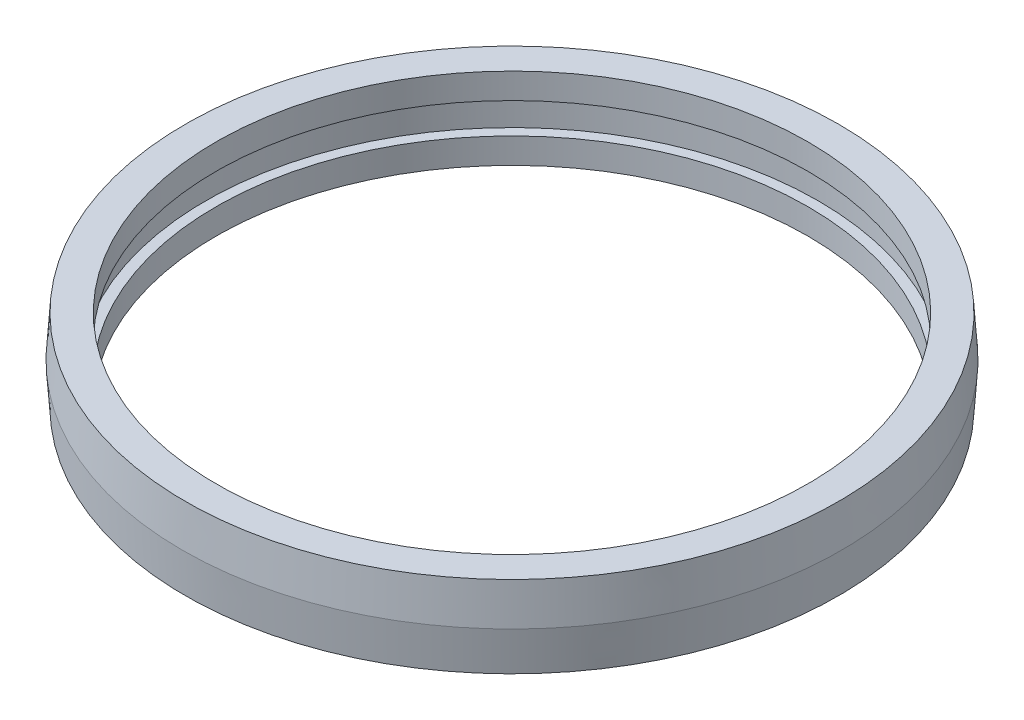
ISO-10303-21;
HEADER;
FILE_DESCRIPTION(('STEP AP214'),'2;1');
FILE_NAME('part.step','',(''),(''),'','','');
FILE_SCHEMA(('AUTOMOTIVE_DESIGN { 1 0 10303 214 1 1 1 1 }'));
ENDSEC;
DATA;
#1=APPLICATION_CONTEXT('core data for automotive mechanical design processes');
#2=APPLICATION_PROTOCOL_DEFINITION('international standard','automotive_design',2000,#1);
#3=PRODUCT_CONTEXT('',#1,'mechanical');
#4=PRODUCT('Part','Part','',(#3));
#5=PRODUCT_RELATED_PRODUCT_CATEGORY('part','',(#4));
#6=PRODUCT_DEFINITION_FORMATION('','',#4);
#7=PRODUCT_DEFINITION_CONTEXT('part definition',#1,'design');
#8=PRODUCT_DEFINITION('design','',#6,#7);
#9=PRODUCT_DEFINITION_SHAPE('','',#8);
#10=(LENGTH_UNIT() NAMED_UNIT(*) SI_UNIT(.MILLI.,.METRE.));
#11=(NAMED_UNIT(*) PLANE_ANGLE_UNIT() SI_UNIT($,.RADIAN.));
#12=(NAMED_UNIT(*) SI_UNIT($,.STERADIAN.) SOLID_ANGLE_UNIT());
#13=UNCERTAINTY_MEASURE_WITH_UNIT(LENGTH_MEASURE(1.E-05),#10,'distance_accuracy_value','');
#14=(GEOMETRIC_REPRESENTATION_CONTEXT(3) GLOBAL_UNCERTAINTY_ASSIGNED_CONTEXT((#13)) GLOBAL_UNIT_ASSIGNED_CONTEXT((#10,
#11,#12)) REPRESENTATION_CONTEXT('',''));
#15=CARTESIAN_POINT('',(0.,0.,0.));
#16=DIRECTION('',(0.,0.,1.));
#17=DIRECTION('',(1.,0.,0.));
#18=AXIS2_PLACEMENT_3D('',#15,#16,#17);
#19=CARTESIAN_POINT('',(0.,0.,0.));
#20=DIRECTION('',(0.,-1.,0.));
#21=DIRECTION('',(0.,0.,-1.));
#22=AXIS2_PLACEMENT_3D('',#19,#20,#21);
#23=CYLINDRICAL_SURFACE('',#22,92.075);
#24=CARTESIAN_POINT('',(0.,-4.76249999996453,0.));
#25=DIRECTION('',(0.,-1.,0.));
#26=DIRECTION('',(0.,0.,-1.));
#27=AXIS2_PLACEMENT_3D('',#24,#25,#26);
#28=CIRCLE('',#27,92.075);
#29=CARTESIAN_POINT('',(0.,-4.76249999996453,-92.075));
#30=VERTEX_POINT('',#29);
#31=EDGE_CURVE('E10',#30,#30,#28,.T.);
#32=ORIENTED_EDGE('',*,*,#31,.F.);
#33=EDGE_LOOP('',(#32));
#34=FACE_BOUND('',#33,.T.);
#35=CARTESIAN_POINT('',(0.,-12.6999999999596,0.));
#36=DIRECTION('',(0.,-1.,0.));
#37=DIRECTION('',(0.,0.,-1.));
#38=AXIS2_PLACEMENT_3D('',#35,#36,#37);
#39=CIRCLE('',#38,92.075);
#40=CARTESIAN_POINT('',(0.,-12.6999999999596,-92.075));
#41=VERTEX_POINT('',#40);
#42=EDGE_CURVE('E67',#41,#41,#39,.T.);
#43=ORIENTED_EDGE('',*,*,#42,.T.);
#44=EDGE_LOOP('',(#43));
#45=FACE_BOUND('',#44,.T.);
#46=ADVANCED_FACE('F36',(#34,#45),#23,.F.);
#47=CARTESIAN_POINT('',(-92.075,-4.76249999996453,0.));
#48=DIRECTION('',(0.,-1.,0.));
#49=DIRECTION('',(0.,0.,-1.));
#50=AXIS2_PLACEMENT_3D('',#47,#48,#49);
#51=PLANE('',#50);
#52=CARTESIAN_POINT('',(0.,-4.76249999996453,0.));
#53=DIRECTION('',(0.,-1.,0.));
#54=DIRECTION('',(0.,0.,-1.));
#55=AXIS2_PLACEMENT_3D('',#52,#53,#54);
#56=CIRCLE('',#55,95.25);
#57=CARTESIAN_POINT('',(0.,-4.76249999996453,-95.25));
#58=VERTEX_POINT('',#57);
#59=EDGE_CURVE('E42',#58,#58,#56,.T.);
#60=ORIENTED_EDGE('',*,*,#59,.F.);
#61=EDGE_LOOP('',(#60));
#62=FACE_BOUND('',#61,.T.);
#63=ORIENTED_EDGE('',*,*,#31,.T.);
#64=EDGE_LOOP('',(#63));
#65=FACE_BOUND('',#64,.T.);
#66=ADVANCED_FACE('F110',(#62,#65),#51,.F.);
#67=CARTESIAN_POINT('',(0.,0.,0.));
#68=DIRECTION('',(0.,-1.,0.));
#69=DIRECTION('',(0.,0.,-1.));
#70=AXIS2_PLACEMENT_3D('',#67,#68,#69);
#71=CYLINDRICAL_SURFACE('',#70,95.25);
#72=CARTESIAN_POINT('',(0.,4.76250000003547,0.));
#73=DIRECTION('',(0.,-1.,0.));
#74=DIRECTION('',(0.,0.,-1.));
#75=AXIS2_PLACEMENT_3D('',#72,#73,#74);
#76=CIRCLE('',#75,95.25);
#77=CARTESIAN_POINT('',(0.,4.76250000003547,-95.25));
#78=VERTEX_POINT('',#77);
#79=EDGE_CURVE('E46',#78,#78,#76,.T.);
#80=ORIENTED_EDGE('',*,*,#79,.F.);
#81=EDGE_LOOP('',(#80));
#82=FACE_BOUND('',#81,.T.);
#83=ORIENTED_EDGE('',*,*,#59,.T.);
#84=EDGE_LOOP('',(#83));
#85=FACE_BOUND('',#84,.T.);
#86=ADVANCED_FACE('F105',(#82,#85),#71,.F.);
#87=CARTESIAN_POINT('',(-95.25,4.76250000003547,0.));
#88=DIRECTION('',(0.,1.,0.));
#89=DIRECTION('',(0.,0.,1.));
#90=AXIS2_PLACEMENT_3D('',#87,#88,#89);
#91=PLANE('',#90);
#92=CARTESIAN_POINT('',(0.,4.76250000003547,0.));
#93=DIRECTION('',(0.,-1.,0.));
#94=DIRECTION('',(0.,0.,-1.));
#95=AXIS2_PLACEMENT_3D('',#92,#93,#94);
#96=CIRCLE('',#95,92.075);
#97=CARTESIAN_POINT('',(0.,4.76250000003547,-92.075));
#98=VERTEX_POINT('',#97);
#99=EDGE_CURVE('E50',#98,#98,#96,.T.);
#100=ORIENTED_EDGE('',*,*,#99,.F.);
#101=EDGE_LOOP('',(#100));
#102=FACE_BOUND('',#101,.T.);
#103=ORIENTED_EDGE('',*,*,#79,.T.);
#104=EDGE_LOOP('',(#103));
#105=FACE_BOUND('',#104,.T.);
#106=ADVANCED_FACE('F99',(#102,#105),#91,.F.);
#107=CARTESIAN_POINT('',(0.,0.,0.));
#108=DIRECTION('',(0.,-1.,0.));
#109=DIRECTION('',(0.,0.,-1.));
#110=AXIS2_PLACEMENT_3D('',#107,#108,#109);
#111=CYLINDRICAL_SURFACE('',#110,92.075);
#112=CARTESIAN_POINT('',(0.,12.7000000000355,0.));
#113=DIRECTION('',(0.,-1.,0.));
#114=DIRECTION('',(0.,0.,-1.));
#115=AXIS2_PLACEMENT_3D('',#112,#113,#114);
#116=CIRCLE('',#115,92.075);
#117=CARTESIAN_POINT('',(0.,12.7000000000355,-92.075));
#118=VERTEX_POINT('',#117);
#119=EDGE_CURVE('E55',#118,#118,#116,.T.);
#120=ORIENTED_EDGE('',*,*,#119,.F.);
#121=EDGE_LOOP('',(#120));
#122=FACE_BOUND('',#121,.T.);
#123=ORIENTED_EDGE('',*,*,#99,.T.);
#124=EDGE_LOOP('',(#123));
#125=FACE_BOUND('',#124,.T.);
#126=ADVANCED_FACE('F93',(#122,#125),#111,.F.);
#127=CARTESIAN_POINT('',(-92.075,12.7000000000355,0.));
#128=DIRECTION('',(0.,-1.,0.));
#129=DIRECTION('',(0.,0.,-1.));
#130=AXIS2_PLACEMENT_3D('',#127,#128,#129);
#131=PLANE('',#130);
#132=CARTESIAN_POINT('',(0.,12.7000000000355,0.));
#133=DIRECTION('',(0.,-1.,0.));
#134=DIRECTION('',(0.,0.,-1.));
#135=AXIS2_PLACEMENT_3D('',#132,#133,#134);
#136=CIRCLE('',#135,101.599999999995);
#137=CARTESIAN_POINT('',(0.,12.7000000000355,-101.599999999995));
#138=VERTEX_POINT('',#137);
#139=EDGE_CURVE('E58',#138,#138,#136,.T.);
#140=ORIENTED_EDGE('',*,*,#139,.F.);
#141=EDGE_LOOP('',(#140));
#142=FACE_BOUND('',#141,.T.);
#143=ORIENTED_EDGE('',*,*,#119,.T.);
#144=EDGE_LOOP('',(#143));
#145=FACE_BOUND('',#144,.T.);
#146=ADVANCED_FACE('F87',(#142,#145),#131,.F.);
#147=CARTESIAN_POINT('',(0.,12.7000000000355,0.));
#148=DIRECTION('',(0.,-1.,0.));
#149=DIRECTION('',(0.,0.,-1.));
#150=AXIS2_PLACEMENT_3D('',#147,#148,#149);
#151=CONICAL_SURFACE('',#150,101.599999999995,0.0698131700799731);
#152=CARTESIAN_POINT('',(0.,0.,0.));
#153=DIRECTION('',(0.,-1.,0.));
#154=DIRECTION('',(0.,0.,-1.));
#155=AXIS2_PLACEMENT_3D('',#152,#153,#154);
#156=CIRCLE('',#155,102.488070511683);
#157=CARTESIAN_POINT('',(0.,0.,-102.488070511683));
#158=VERTEX_POINT('',#157);
#159=EDGE_CURVE('E61',#158,#158,#156,.T.);
#160=ORIENTED_EDGE('',*,*,#159,.F.);
#161=EDGE_LOOP('',(#160));
#162=FACE_BOUND('',#161,.T.);
#163=ORIENTED_EDGE('',*,*,#139,.T.);
#164=EDGE_LOOP('',(#163));
#165=FACE_BOUND('',#164,.T.);
#166=ADVANCED_FACE('F81',(#162,#165),#151,.T.);
#167=CARTESIAN_POINT('',(0.,0.,0.));
#168=DIRECTION('',(0.,1.,0.));
#169=DIRECTION('',(0.,0.,1.));
#170=AXIS2_PLACEMENT_3D('',#167,#168,#169);
#171=CONICAL_SURFACE('',#170,102.488070511683,0.0698131700799735);
#172=CARTESIAN_POINT('',(0.,-12.6999999999596,0.));
#173=DIRECTION('',(0.,-1.,0.));
#174=DIRECTION('',(0.,0.,-1.));
#175=AXIS2_PLACEMENT_3D('',#172,#173,#174);
#176=CIRCLE('',#175,101.600000000001);
#177=CARTESIAN_POINT('',(0.,-12.6999999999596,-101.600000000001));
#178=VERTEX_POINT('',#177);
#179=EDGE_CURVE('E64',#178,#178,#176,.T.);
#180=ORIENTED_EDGE('',*,*,#179,.F.);
#181=EDGE_LOOP('',(#180));
#182=FACE_BOUND('',#181,.T.);
#183=ORIENTED_EDGE('',*,*,#159,.T.);
#184=EDGE_LOOP('',(#183));
#185=FACE_BOUND('',#184,.T.);
#186=ADVANCED_FACE('F75',(#182,#185),#171,.T.);
#187=CARTESIAN_POINT('',(-101.600000000001,-12.6999999999596,0.));
#188=DIRECTION('',(0.,1.,0.));
#189=DIRECTION('',(0.,0.,1.));
#190=AXIS2_PLACEMENT_3D('',#187,#188,#189);
#191=PLANE('',#190);
#192=ORIENTED_EDGE('',*,*,#42,.F.);
#193=EDGE_LOOP('',(#192));
#194=FACE_BOUND('',#193,.T.);
#195=ORIENTED_EDGE('',*,*,#179,.T.);
#196=EDGE_LOOP('',(#195));
#197=FACE_BOUND('',#196,.T.);
#198=ADVANCED_FACE('F72',(#194,#197),#191,.F.);
#199=CLOSED_SHELL('',(#46,#66,#86,#106,#126,#146,#166,#186,#198));
#200=MANIFOLD_SOLID_BREP('B2',#199);
#201=ADVANCED_BREP_SHAPE_REPRESENTATION('',(#18,#200),#14);
#202=SHAPE_DEFINITION_REPRESENTATION(#9,#201);
ENDSEC;
END-ISO-10303-21;
